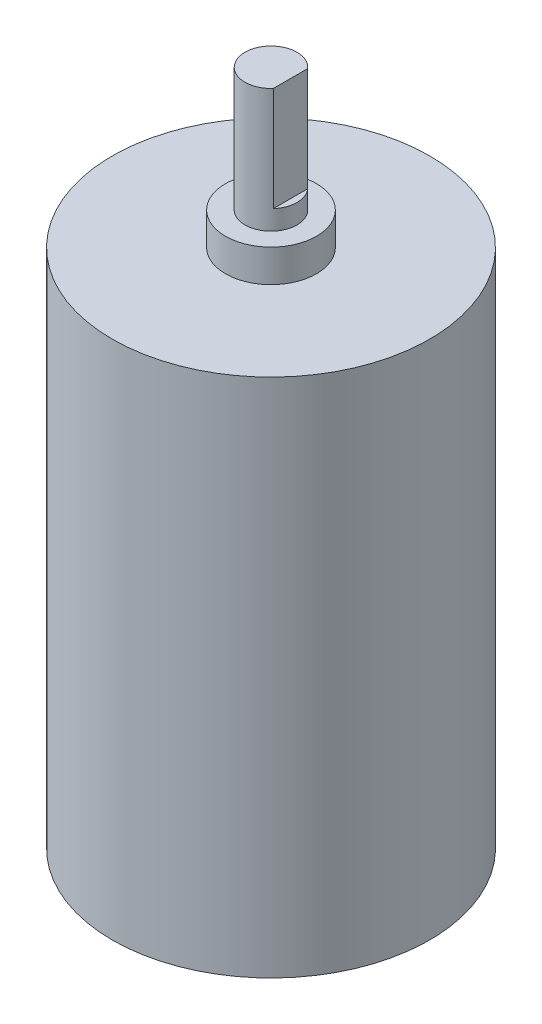
ISO-10303-21;
HEADER;
FILE_DESCRIPTION(('STEP AP214'),'2;1');
FILE_NAME('part.step','',(''),(''),'','','');
FILE_SCHEMA(('AUTOMOTIVE_DESIGN { 1 0 10303 214 1 1 1 1 }'));
ENDSEC;
DATA;
#1=APPLICATION_CONTEXT('core data for automotive mechanical design processes');
#2=APPLICATION_PROTOCOL_DEFINITION('international standard','automotive_design',2000,#1);
#3=PRODUCT_CONTEXT('',#1,'mechanical');
#4=PRODUCT('Part','Part','',(#3));
#5=PRODUCT_RELATED_PRODUCT_CATEGORY('part','',(#4));
#6=PRODUCT_DEFINITION_FORMATION('','',#4);
#7=PRODUCT_DEFINITION_CONTEXT('part definition',#1,'design');
#8=PRODUCT_DEFINITION('design','',#6,#7);
#9=PRODUCT_DEFINITION_SHAPE('','',#8);
#10=(LENGTH_UNIT() NAMED_UNIT(*) SI_UNIT(.MILLI.,.METRE.));
#11=(NAMED_UNIT(*) PLANE_ANGLE_UNIT() SI_UNIT($,.RADIAN.));
#12=(NAMED_UNIT(*) SI_UNIT($,.STERADIAN.) SOLID_ANGLE_UNIT());
#13=UNCERTAINTY_MEASURE_WITH_UNIT(LENGTH_MEASURE(1.E-05),#10,'distance_accuracy_value','');
#14=(GEOMETRIC_REPRESENTATION_CONTEXT(3) GLOBAL_UNCERTAINTY_ASSIGNED_CONTEXT((#13)) GLOBAL_UNIT_ASSIGNED_CONTEXT((#10,
#11,#12)) REPRESENTATION_CONTEXT('',''));
#15=CARTESIAN_POINT('',(0.,0.,0.));
#16=DIRECTION('',(0.,0.,1.));
#17=DIRECTION('',(1.,0.,0.));
#18=AXIS2_PLACEMENT_3D('',#15,#16,#17);
#19=CARTESIAN_POINT('',(0.,40.,0.));
#20=DIRECTION('',(0.,-1.,0.));
#21=DIRECTION('',(0.,0.,-1.));
#22=AXIS2_PLACEMENT_3D('',#19,#20,#21);
#23=CYLINDRICAL_SURFACE('',#22,12.2);
#24=CARTESIAN_POINT('',(0.,40.,0.));
#25=DIRECTION('',(0.,1.,0.));
#26=DIRECTION('',(0.,0.,1.));
#27=AXIS2_PLACEMENT_3D('',#24,#25,#26);
#28=CIRCLE('',#27,12.2);
#29=CARTESIAN_POINT('',(0.,40.,12.2));
#30=VERTEX_POINT('',#29);
#31=EDGE_CURVE('E82',#30,#30,#28,.T.);
#32=ORIENTED_EDGE('',*,*,#31,.F.);
#33=EDGE_LOOP('',(#32));
#34=FACE_BOUND('',#33,.T.);
#35=CARTESIAN_POINT('',(0.,0.,0.));
#36=DIRECTION('',(0.,1.,0.));
#37=DIRECTION('',(0.,0.,1.));
#38=AXIS2_PLACEMENT_3D('',#35,#36,#37);
#39=CIRCLE('',#38,12.2);
#40=CARTESIAN_POINT('',(0.,0.,12.2));
#41=VERTEX_POINT('',#40);
#42=EDGE_CURVE('E73',#41,#41,#39,.T.);
#43=ORIENTED_EDGE('',*,*,#42,.T.);
#44=EDGE_LOOP('',(#43));
#45=FACE_BOUND('',#44,.T.);
#46=ADVANCED_FACE('F33',(#34,#45),#23,.T.);
#47=CARTESIAN_POINT('',(0.,40.,0.));
#48=DIRECTION('',(0.,1.,0.));
#49=DIRECTION('',(0.,0.,1.));
#50=AXIS2_PLACEMENT_3D('',#47,#48,#49);
#51=PLANE('',#50);
#52=CARTESIAN_POINT('',(0.,40.,0.));
#53=DIRECTION('',(0.,1.,0.));
#54=DIRECTION('',(0.,0.,1.));
#55=AXIS2_PLACEMENT_3D('',#52,#53,#54);
#56=CIRCLE('',#55,3.5);
#57=CARTESIAN_POINT('',(0.,40.,3.5));
#58=VERTEX_POINT('',#57);
#59=EDGE_CURVE('E78',#58,#58,#56,.T.);
#60=ORIENTED_EDGE('',*,*,#59,.F.);
#61=EDGE_LOOP('',(#60));
#62=FACE_BOUND('',#61,.T.);
#63=ORIENTED_EDGE('',*,*,#31,.T.);
#64=EDGE_LOOP('',(#63));
#65=FACE_BOUND('',#64,.T.);
#66=ADVANCED_FACE('F92',(#62,#65),#51,.T.);
#67=CARTESIAN_POINT('',(0.,0.,0.));
#68=DIRECTION('',(0.,1.,0.));
#69=DIRECTION('',(0.,0.,1.));
#70=AXIS2_PLACEMENT_3D('',#67,#68,#69);
#71=PLANE('',#70);
#72=ORIENTED_EDGE('',*,*,#42,.F.);
#73=EDGE_LOOP('',(#72));
#74=FACE_BOUND('',#73,.T.);
#75=ADVANCED_FACE('F89',(#74),#71,.F.);
#76=CARTESIAN_POINT('',(0.,42.5,0.));
#77=DIRECTION('',(0.,-1.,0.));
#78=DIRECTION('',(0.,0.,-1.));
#79=AXIS2_PLACEMENT_3D('',#76,#77,#78);
#80=CYLINDRICAL_SURFACE('',#79,3.5);
#81=CARTESIAN_POINT('',(0.,42.5,0.));
#82=DIRECTION('',(0.,1.,0.));
#83=DIRECTION('',(0.,0.,1.));
#84=AXIS2_PLACEMENT_3D('',#81,#82,#83);
#85=CIRCLE('',#84,3.5);
#86=CARTESIAN_POINT('',(0.,42.5,3.5));
#87=VERTEX_POINT('',#86);
#88=EDGE_CURVE('E70',#87,#87,#85,.T.);
#89=ORIENTED_EDGE('',*,*,#88,.F.);
#90=EDGE_LOOP('',(#89));
#91=FACE_BOUND('',#90,.T.);
#92=ORIENTED_EDGE('',*,*,#59,.T.);
#93=EDGE_LOOP('',(#92));
#94=FACE_BOUND('',#93,.T.);
#95=ADVANCED_FACE('F91',(#91,#94),#80,.T.);
#96=CARTESIAN_POINT('',(0.,42.5,0.));
#97=DIRECTION('',(0.,1.,0.));
#98=DIRECTION('',(0.,0.,1.));
#99=AXIS2_PLACEMENT_3D('',#96,#97,#98);
#100=PLANE('',#99);
#101=CARTESIAN_POINT('',(0.,42.5,0.));
#102=DIRECTION('',(0.,1.,0.));
#103=DIRECTION('',(0.,0.,1.));
#104=AXIS2_PLACEMENT_3D('',#101,#102,#103);
#105=CIRCLE('',#104,2.);
#106=CARTESIAN_POINT('',(0.,42.5,2.));
#107=VERTEX_POINT('',#106);
#108=EDGE_CURVE('E61',#107,#107,#105,.T.);
#109=ORIENTED_EDGE('',*,*,#108,.F.);
#110=EDGE_LOOP('',(#109));
#111=FACE_BOUND('',#110,.T.);
#112=ORIENTED_EDGE('',*,*,#88,.T.);
#113=EDGE_LOOP('',(#112));
#114=FACE_BOUND('',#113,.T.);
#115=ADVANCED_FACE('F97',(#111,#114),#100,.T.);
#116=CARTESIAN_POINT('',(0.,52.,0.));
#117=DIRECTION('',(0.,-1.,0.));
#118=DIRECTION('',(0.,0.,-1.));
#119=AXIS2_PLACEMENT_3D('',#116,#117,#118);
#120=CYLINDRICAL_SURFACE('',#119,2.);
#121=CARTESIAN_POINT('',(0.,52.,0.));
#122=DIRECTION('',(0.,1.,0.));
#123=DIRECTION('',(0.,0.,1.));
#124=AXIS2_PLACEMENT_3D('',#121,#122,#123);
#125=CIRCLE('',#124,2.);
#126=CARTESIAN_POINT('',(1.5,52.,-1.32287565553229));
#127=VERTEX_POINT('',#126);
#128=CARTESIAN_POINT('',(1.5,52.,1.32287565553229));
#129=VERTEX_POINT('',#128);
#130=EDGE_CURVE('E66',#127,#129,#125,.T.);
#131=ORIENTED_EDGE('',*,*,#130,.F.);
#132=DIRECTION('',(0.,-1.,0.));
#133=VECTOR('',#132,1.);
#134=CARTESIAN_POINT('',(1.5,52.,-1.32287565553229));
#135=LINE('',#134,#133);
#136=CARTESIAN_POINT('',(1.5,44.,-1.32287565553229));
#137=VERTEX_POINT('',#136);
#138=EDGE_CURVE('E47',#127,#137,#135,.T.);
#139=ORIENTED_EDGE('',*,*,#138,.T.);
#140=CARTESIAN_POINT('',(0.,44.,0.));
#141=DIRECTION('',(0.,1.,0.));
#142=DIRECTION('',(0.,0.,1.));
#143=AXIS2_PLACEMENT_3D('',#140,#141,#142);
#144=CIRCLE('',#143,2.);
#145=CARTESIAN_POINT('',(1.5,44.,1.32287565553229));
#146=VERTEX_POINT('',#145);
#147=EDGE_CURVE('E11',#146,#137,#144,.T.);
#148=ORIENTED_EDGE('',*,*,#147,.F.);
#149=DIRECTION('',(0.,-1.,0.));
#150=VECTOR('',#149,1.);
#151=CARTESIAN_POINT('',(1.5,52.,1.32287565553229));
#152=LINE('',#151,#150);
#153=EDGE_CURVE('E52',#146,#129,#152,.F.);
#154=ORIENTED_EDGE('',*,*,#153,.T.);
#155=EDGE_LOOP('',(#131,#139,#148,#154));
#156=FACE_BOUND('',#155,.T.);
#157=ORIENTED_EDGE('',*,*,#108,.T.);
#158=EDGE_LOOP('',(#157));
#159=FACE_BOUND('',#158,.T.);
#160=ADVANCED_FACE('F64',(#156,#159),#120,.T.);
#161=CARTESIAN_POINT('',(0.,52.,0.));
#162=DIRECTION('',(0.,1.,0.));
#163=DIRECTION('',(0.,0.,1.));
#164=AXIS2_PLACEMENT_3D('',#161,#162,#163);
#165=PLANE('',#164);
#166=DIRECTION('',(0.,0.,1.));
#167=VECTOR('',#166,1.);
#168=CARTESIAN_POINT('',(1.5,52.,0.));
#169=LINE('',#168,#167);
#170=EDGE_CURVE('E40',#127,#129,#169,.T.);
#171=ORIENTED_EDGE('',*,*,#170,.F.);
#172=ORIENTED_EDGE('',*,*,#130,.T.);
#173=EDGE_LOOP('',(#171,#172));
#174=FACE_BOUND('',#173,.T.);
#175=ADVANCED_FACE('F69',(#174),#165,.T.);
#176=CARTESIAN_POINT('',(0.,44.,0.));
#177=DIRECTION('',(0.,1.,0.));
#178=DIRECTION('',(0.,0.,1.));
#179=AXIS2_PLACEMENT_3D('',#176,#177,#178);
#180=PLANE('',#179);
#181=ORIENTED_EDGE('',*,*,#147,.T.);
#182=DIRECTION('',(0.,0.,1.));
#183=VECTOR('',#182,1.);
#184=CARTESIAN_POINT('',(1.5,44.,-2.));
#185=LINE('',#184,#183);
#186=EDGE_CURVE('E67',#137,#146,#185,.T.);
#187=ORIENTED_EDGE('',*,*,#186,.T.);
#188=EDGE_LOOP('',(#181,#187));
#189=FACE_BOUND('',#188,.T.);
#190=ADVANCED_FACE('F146',(#189),#180,.T.);
#191=CARTESIAN_POINT('',(1.5,44.,-2.));
#192=DIRECTION('',(-1.,0.,0.));
#193=DIRECTION('',(0.,0.,1.));
#194=AXIS2_PLACEMENT_3D('',#191,#192,#193);
#195=PLANE('',#194);
#196=ORIENTED_EDGE('',*,*,#170,.T.);
#197=ORIENTED_EDGE('',*,*,#153,.F.);
#198=ORIENTED_EDGE('',*,*,#186,.F.);
#199=ORIENTED_EDGE('',*,*,#138,.F.);
#200=EDGE_LOOP('',(#196,#197,#198,#199));
#201=FACE_BOUND('',#200,.T.);
#202=ADVANCED_FACE('F57',(#201),#195,.F.);
#203=CLOSED_SHELL('',(#46,#66,#75,#95,#115,#160,#175,#190,#202));
#204=MANIFOLD_SOLID_BREP('B2',#203);
#205=ADVANCED_BREP_SHAPE_REPRESENTATION('',(#18,#204),#14);
#206=SHAPE_DEFINITION_REPRESENTATION(#9,#205);
ENDSEC;
END-ISO-10303-21;
